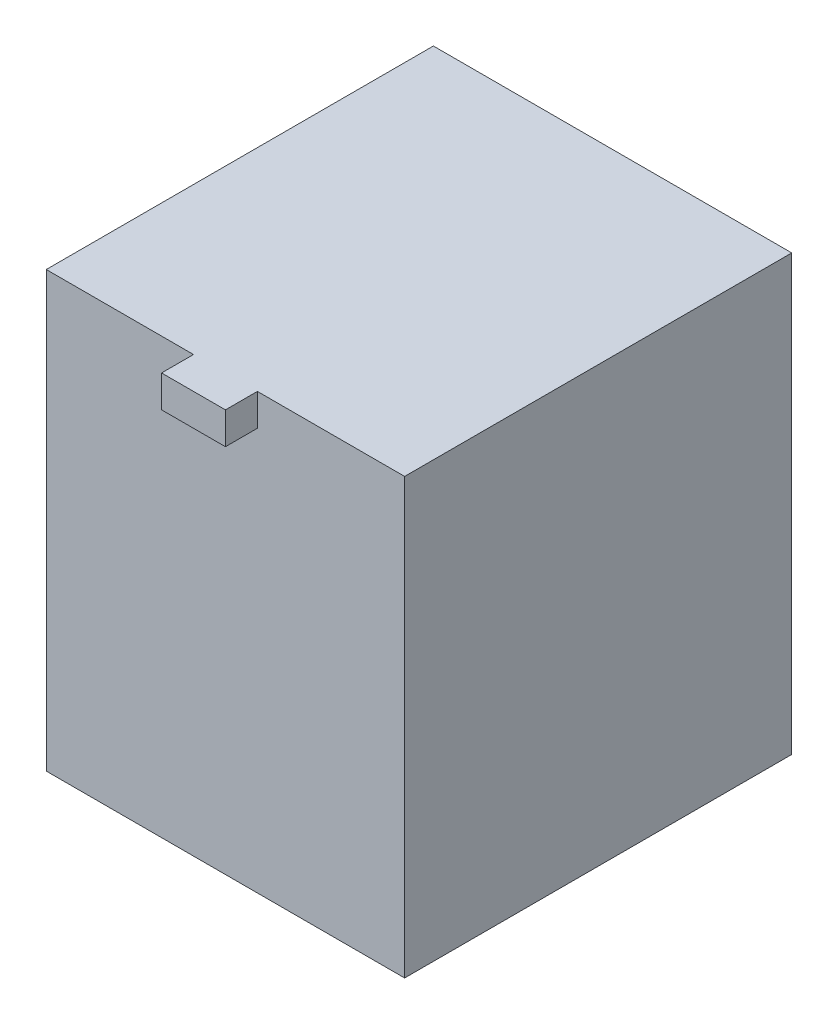
ISO-10303-21;
HEADER;
FILE_DESCRIPTION(('STEP AP214'),'2;1');
FILE_NAME('part.step','',(''),(''),'','','');
FILE_SCHEMA(('AUTOMOTIVE_DESIGN { 1 0 10303 214 1 1 1 1 }'));
ENDSEC;
DATA;
#1=APPLICATION_CONTEXT('core data for automotive mechanical design processes');
#2=APPLICATION_PROTOCOL_DEFINITION('international standard','automotive_design',2000,#1);
#3=PRODUCT_CONTEXT('',#1,'mechanical');
#4=PRODUCT('Part','Part','',(#3));
#5=PRODUCT_RELATED_PRODUCT_CATEGORY('part','',(#4));
#6=PRODUCT_DEFINITION_FORMATION('','',#4);
#7=PRODUCT_DEFINITION_CONTEXT('part definition',#1,'design');
#8=PRODUCT_DEFINITION('design','',#6,#7);
#9=PRODUCT_DEFINITION_SHAPE('','',#8);
#10=(LENGTH_UNIT() NAMED_UNIT(*) SI_UNIT(.MILLI.,.METRE.));
#11=(NAMED_UNIT(*) PLANE_ANGLE_UNIT() SI_UNIT($,.RADIAN.));
#12=(NAMED_UNIT(*) SI_UNIT($,.STERADIAN.) SOLID_ANGLE_UNIT());
#13=UNCERTAINTY_MEASURE_WITH_UNIT(LENGTH_MEASURE(1.E-05),#10,'distance_accuracy_value','');
#14=(GEOMETRIC_REPRESENTATION_CONTEXT(3) GLOBAL_UNCERTAINTY_ASSIGNED_CONTEXT((#13)) GLOBAL_UNIT_ASSIGNED_CONTEXT((#10,
#11,#12)) REPRESENTATION_CONTEXT('',''));
#15=CARTESIAN_POINT('',(0.,0.,0.));
#16=DIRECTION('',(0.,0.,1.));
#17=DIRECTION('',(1.,0.,0.));
#18=AXIS2_PLACEMENT_3D('',#15,#16,#17);
#19=CARTESIAN_POINT('',(28.05,68.,30.3));
#20=DIRECTION('',(-1.,0.,0.));
#21=DIRECTION('',(0.,0.,1.));
#22=AXIS2_PLACEMENT_3D('',#19,#20,#21);
#23=PLANE('',#22);
#24=DIRECTION('',(0.,0.,-1.));
#25=VECTOR('',#24,1.);
#26=CARTESIAN_POINT('',(28.05,0.,30.3));
#27=LINE('',#26,#25);
#28=CARTESIAN_POINT('',(28.05,0.,30.3));
#29=VERTEX_POINT('',#28);
#30=CARTESIAN_POINT('',(28.05,0.,-30.3));
#31=VERTEX_POINT('',#30);
#32=EDGE_CURVE('E138',#29,#31,#27,.T.);
#33=ORIENTED_EDGE('',*,*,#32,.T.);
#34=DIRECTION('',(0.,-1.,0.));
#35=VECTOR('',#34,1.);
#36=CARTESIAN_POINT('',(28.05,68.,-30.3));
#37=LINE('',#36,#35);
#38=CARTESIAN_POINT('',(28.05,68.,-30.3));
#39=VERTEX_POINT('',#38);
#40=EDGE_CURVE('E11',#39,#31,#37,.T.);
#41=ORIENTED_EDGE('',*,*,#40,.F.);
#42=DIRECTION('',(0.,0.,-1.));
#43=VECTOR('',#42,1.);
#44=CARTESIAN_POINT('',(28.05,68.,30.3));
#45=LINE('',#44,#43);
#46=CARTESIAN_POINT('',(28.05,68.,30.3));
#47=VERTEX_POINT('',#46);
#48=EDGE_CURVE('E149',#47,#39,#45,.T.);
#49=ORIENTED_EDGE('',*,*,#48,.F.);
#50=DIRECTION('',(0.,-1.,0.));
#51=VECTOR('',#50,1.);
#52=CARTESIAN_POINT('',(28.05,68.,30.3));
#53=LINE('',#52,#51);
#54=EDGE_CURVE('E160',#47,#29,#53,.T.);
#55=ORIENTED_EDGE('',*,*,#54,.T.);
#56=EDGE_LOOP('',(#33,#41,#49,#55));
#57=FACE_BOUND('',#56,.T.);
#58=ADVANCED_FACE('F45',(#57),#23,.F.);
#59=CARTESIAN_POINT('',(-28.05,68.,-30.3));
#60=DIRECTION('',(0.,0.,1.));
#61=DIRECTION('',(1.,0.,0.));
#62=AXIS2_PLACEMENT_3D('',#59,#60,#61);
#63=PLANE('',#62);
#64=DIRECTION('',(-1.,0.,0.));
#65=VECTOR('',#64,1.);
#66=CARTESIAN_POINT('',(-28.05,0.,-30.3));
#67=LINE('',#66,#65);
#68=CARTESIAN_POINT('',(-28.05,0.,-30.3));
#69=VERTEX_POINT('',#68);
#70=EDGE_CURVE('E143',#31,#69,#67,.T.);
#71=ORIENTED_EDGE('',*,*,#70,.T.);
#72=DIRECTION('',(0.,-1.,0.));
#73=VECTOR('',#72,1.);
#74=CARTESIAN_POINT('',(-28.05,68.,-30.3));
#75=LINE('',#74,#73);
#76=CARTESIAN_POINT('',(-28.05,68.,-30.3));
#77=VERTEX_POINT('',#76);
#78=EDGE_CURVE('E53',#77,#69,#75,.T.);
#79=ORIENTED_EDGE('',*,*,#78,.F.);
#80=DIRECTION('',(-1.,0.,0.));
#81=VECTOR('',#80,1.);
#82=CARTESIAN_POINT('',(-28.05,68.,-30.3));
#83=LINE('',#82,#81);
#84=EDGE_CURVE('E152',#39,#77,#83,.T.);
#85=ORIENTED_EDGE('',*,*,#84,.F.);
#86=ORIENTED_EDGE('',*,*,#40,.T.);
#87=EDGE_LOOP('',(#71,#79,#85,#86));
#88=FACE_BOUND('',#87,.T.);
#89=ADVANCED_FACE('F223',(#88),#63,.F.);
#90=CARTESIAN_POINT('',(-28.05,68.,30.3));
#91=DIRECTION('',(1.,0.,0.));
#92=DIRECTION('',(0.,0.,-1.));
#93=AXIS2_PLACEMENT_3D('',#90,#91,#92);
#94=PLANE('',#93);
#95=DIRECTION('',(0.,0.,1.));
#96=VECTOR('',#95,1.);
#97=CARTESIAN_POINT('',(-28.05,0.,30.3));
#98=LINE('',#97,#96);
#99=CARTESIAN_POINT('',(-28.05,0.,30.3));
#100=VERTEX_POINT('',#99);
#101=EDGE_CURVE('E164',#69,#100,#98,.T.);
#102=ORIENTED_EDGE('',*,*,#101,.T.);
#103=DIRECTION('',(0.,-1.,0.));
#104=VECTOR('',#103,1.);
#105=CARTESIAN_POINT('',(-28.05,68.,30.3));
#106=LINE('',#105,#104);
#107=CARTESIAN_POINT('',(-28.05,68.,30.3));
#108=VERTEX_POINT('',#107);
#109=EDGE_CURVE('E172',#108,#100,#106,.T.);
#110=ORIENTED_EDGE('',*,*,#109,.F.);
#111=DIRECTION('',(0.,0.,1.));
#112=VECTOR('',#111,1.);
#113=CARTESIAN_POINT('',(-28.05,68.,30.3));
#114=LINE('',#113,#112);
#115=EDGE_CURVE('E156',#77,#108,#114,.T.);
#116=ORIENTED_EDGE('',*,*,#115,.F.);
#117=ORIENTED_EDGE('',*,*,#78,.T.);
#118=EDGE_LOOP('',(#102,#110,#116,#117));
#119=FACE_BOUND('',#118,.T.);
#120=ADVANCED_FACE('F181',(#119),#94,.F.);
#121=CARTESIAN_POINT('',(-28.05,68.,30.3));
#122=DIRECTION('',(0.,0.,-1.));
#123=DIRECTION('',(-1.,0.,0.));
#124=AXIS2_PLACEMENT_3D('',#121,#122,#123);
#125=PLANE('',#124);
#126=DIRECTION('',(1.,0.,0.));
#127=VECTOR('',#126,1.);
#128=CARTESIAN_POINT('',(-28.05,68.,30.3));
#129=LINE('',#128,#127);
#130=CARTESIAN_POINT('',(5.,68.,30.3));
#131=VERTEX_POINT('',#130);
#132=EDGE_CURVE('E65',#131,#47,#129,.T.);
#133=ORIENTED_EDGE('',*,*,#132,.F.);
#134=DIRECTION('',(0.,-1.,0.));
#135=VECTOR('',#134,1.);
#136=CARTESIAN_POINT('',(5.,0.,30.3));
#137=LINE('',#136,#135);
#138=CARTESIAN_POINT('',(5.,63.,30.3));
#139=VERTEX_POINT('',#138);
#140=EDGE_CURVE('E60',#131,#139,#137,.T.);
#141=ORIENTED_EDGE('',*,*,#140,.T.);
#142=DIRECTION('',(-1.,0.,0.));
#143=VECTOR('',#142,1.);
#144=CARTESIAN_POINT('',(-3.49720252756924E-13,63.,30.3));
#145=LINE('',#144,#143);
#146=CARTESIAN_POINT('',(-5.00000000000001,62.9999999999999,30.3));
#147=VERTEX_POINT('',#146);
#148=EDGE_CURVE('E200',#139,#147,#145,.T.);
#149=ORIENTED_EDGE('',*,*,#148,.T.);
#150=DIRECTION('',(0.,-1.,0.));
#151=VECTOR('',#150,1.);
#152=CARTESIAN_POINT('',(-5.00000000000001,0.,30.3));
#153=LINE('',#152,#151);
#154=CARTESIAN_POINT('',(-5.,68.,30.3));
#155=VERTEX_POINT('',#154);
#156=EDGE_CURVE('E203',#155,#147,#153,.T.);
#157=ORIENTED_EDGE('',*,*,#156,.F.);
#158=EDGE_CURVE('E136',#108,#155,#129,.T.);
#159=ORIENTED_EDGE('',*,*,#158,.F.);
#160=ORIENTED_EDGE('',*,*,#109,.T.);
#161=DIRECTION('',(1.,0.,0.));
#162=VECTOR('',#161,1.);
#163=CARTESIAN_POINT('',(-28.05,0.,30.3));
#164=LINE('',#163,#162);
#165=EDGE_CURVE('E153',#100,#29,#164,.T.);
#166=ORIENTED_EDGE('',*,*,#165,.T.);
#167=ORIENTED_EDGE('',*,*,#54,.F.);
#168=EDGE_LOOP('',(#133,#141,#149,#157,#159,#160,#166,#167));
#169=FACE_BOUND('',#168,.T.);
#170=ADVANCED_FACE('F188',(#169),#125,.F.);
#171=CARTESIAN_POINT('',(0.,68.,0.));
#172=DIRECTION('',(0.,-1.,0.));
#173=DIRECTION('',(0.,0.,-1.));
#174=AXIS2_PLACEMENT_3D('',#171,#172,#173);
#175=PLANE('',#174);
#176=ORIENTED_EDGE('',*,*,#48,.T.);
#177=ORIENTED_EDGE('',*,*,#84,.T.);
#178=ORIENTED_EDGE('',*,*,#115,.T.);
#179=ORIENTED_EDGE('',*,*,#158,.T.);
#180=DIRECTION('',(0.,0.,-1.));
#181=VECTOR('',#180,1.);
#182=CARTESIAN_POINT('',(-5.00000000000001,68.,35.3));
#183=LINE('',#182,#181);
#184=CARTESIAN_POINT('',(-5.00000000000001,68.,35.3));
#185=VERTEX_POINT('',#184);
#186=EDGE_CURVE('E114',#185,#155,#183,.T.);
#187=ORIENTED_EDGE('',*,*,#186,.F.);
#188=DIRECTION('',(-1.,0.,0.));
#189=VECTOR('',#188,1.);
#190=CARTESIAN_POINT('',(0.,68.,35.3));
#191=LINE('',#190,#189);
#192=CARTESIAN_POINT('',(5.,68.,35.3));
#193=VERTEX_POINT('',#192);
#194=EDGE_CURVE('E122',#193,#185,#191,.T.);
#195=ORIENTED_EDGE('',*,*,#194,.F.);
#196=DIRECTION('',(0.,0.,-1.));
#197=VECTOR('',#196,1.);
#198=CARTESIAN_POINT('',(5.,68.,35.3));
#199=LINE('',#198,#197);
#200=EDGE_CURVE('E192',#193,#131,#199,.T.);
#201=ORIENTED_EDGE('',*,*,#200,.T.);
#202=ORIENTED_EDGE('',*,*,#132,.T.);
#203=EDGE_LOOP('',(#176,#177,#178,#179,#187,#195,#201,#202));
#204=FACE_BOUND('',#203,.T.);
#205=ADVANCED_FACE('F134',(#204),#175,.F.);
#206=CARTESIAN_POINT('',(0.,0.,0.));
#207=DIRECTION('',(0.,-1.,0.));
#208=DIRECTION('',(0.,0.,-1.));
#209=AXIS2_PLACEMENT_3D('',#206,#207,#208);
#210=PLANE('',#209);
#211=ORIENTED_EDGE('',*,*,#32,.F.);
#212=ORIENTED_EDGE('',*,*,#165,.F.);
#213=ORIENTED_EDGE('',*,*,#101,.F.);
#214=ORIENTED_EDGE('',*,*,#70,.F.);
#215=EDGE_LOOP('',(#211,#212,#213,#214));
#216=FACE_BOUND('',#215,.T.);
#217=ADVANCED_FACE('F187',(#216),#210,.T.);
#218=CARTESIAN_POINT('',(-5.00000000000001,0.,35.3));
#219=DIRECTION('',(1.,0.,0.));
#220=DIRECTION('',(0.,0.,-1.));
#221=AXIS2_PLACEMENT_3D('',#218,#219,#220);
#222=PLANE('',#221);
#223=ORIENTED_EDGE('',*,*,#156,.T.);
#224=DIRECTION('',(0.,0.,-1.));
#225=VECTOR('',#224,1.);
#226=CARTESIAN_POINT('',(-5.00000000000001,62.9999999999999,35.3));
#227=LINE('',#226,#225);
#228=CARTESIAN_POINT('',(-5.00000000000001,62.9999999999999,35.3));
#229=VERTEX_POINT('',#228);
#230=EDGE_CURVE('E116',#229,#147,#227,.T.);
#231=ORIENTED_EDGE('',*,*,#230,.F.);
#232=DIRECTION('',(0.,-1.,0.));
#233=VECTOR('',#232,1.);
#234=CARTESIAN_POINT('',(-5.00000000000001,0.,35.3));
#235=LINE('',#234,#233);
#236=EDGE_CURVE('E109',#185,#229,#235,.T.);
#237=ORIENTED_EDGE('',*,*,#236,.F.);
#238=ORIENTED_EDGE('',*,*,#186,.T.);
#239=EDGE_LOOP('',(#223,#231,#237,#238));
#240=FACE_BOUND('',#239,.T.);
#241=ADVANCED_FACE('F112',(#240),#222,.F.);
#242=CARTESIAN_POINT('',(-3.49720252756924E-13,63.,35.3));
#243=DIRECTION('',(0.,-1.,0.));
#244=DIRECTION('',(1.,0.,0.));
#245=AXIS2_PLACEMENT_3D('',#242,#243,#244);
#246=PLANE('',#245);
#247=ORIENTED_EDGE('',*,*,#148,.F.);
#248=DIRECTION('',(0.,0.,-1.));
#249=VECTOR('',#248,1.);
#250=CARTESIAN_POINT('',(5.,63.,35.3));
#251=LINE('',#250,#249);
#252=CARTESIAN_POINT('',(5.,63.,35.3));
#253=VERTEX_POINT('',#252);
#254=EDGE_CURVE('E145',#253,#139,#251,.T.);
#255=ORIENTED_EDGE('',*,*,#254,.F.);
#256=DIRECTION('',(-1.,0.,0.));
#257=VECTOR('',#256,1.);
#258=CARTESIAN_POINT('',(-3.49720252756924E-13,63.,35.3));
#259=LINE('',#258,#257);
#260=EDGE_CURVE('E121',#253,#229,#259,.T.);
#261=ORIENTED_EDGE('',*,*,#260,.T.);
#262=ORIENTED_EDGE('',*,*,#230,.T.);
#263=EDGE_LOOP('',(#247,#255,#261,#262));
#264=FACE_BOUND('',#263,.T.);
#265=ADVANCED_FACE('F213',(#264),#246,.T.);
#266=CARTESIAN_POINT('',(5.,0.,35.3));
#267=DIRECTION('',(1.,0.,0.));
#268=DIRECTION('',(0.,0.,-1.));
#269=AXIS2_PLACEMENT_3D('',#266,#267,#268);
#270=PLANE('',#269);
#271=ORIENTED_EDGE('',*,*,#140,.F.);
#272=ORIENTED_EDGE('',*,*,#200,.F.);
#273=DIRECTION('',(0.,-1.,0.));
#274=VECTOR('',#273,1.);
#275=CARTESIAN_POINT('',(5.,0.,35.3));
#276=LINE('',#275,#274);
#277=EDGE_CURVE('E128',#193,#253,#276,.T.);
#278=ORIENTED_EDGE('',*,*,#277,.T.);
#279=ORIENTED_EDGE('',*,*,#254,.T.);
#280=EDGE_LOOP('',(#271,#272,#278,#279));
#281=FACE_BOUND('',#280,.T.);
#282=ADVANCED_FACE('F197',(#281),#270,.T.);
#283=CARTESIAN_POINT('',(0.,0.,35.3));
#284=DIRECTION('',(0.,0.,1.));
#285=DIRECTION('',(1.,0.,0.));
#286=AXIS2_PLACEMENT_3D('',#283,#284,#285);
#287=PLANE('',#286);
#288=ORIENTED_EDGE('',*,*,#194,.T.);
#289=ORIENTED_EDGE('',*,*,#236,.T.);
#290=ORIENTED_EDGE('',*,*,#260,.F.);
#291=ORIENTED_EDGE('',*,*,#277,.F.);
#292=EDGE_LOOP('',(#288,#289,#290,#291));
#293=FACE_BOUND('',#292,.T.);
#294=ADVANCED_FACE('F126',(#293),#287,.T.);
#295=CLOSED_SHELL('',(#58,#89,#120,#170,#205,#217,#241,#265,#282,#294));
#296=MANIFOLD_SOLID_BREP('B2',#295);
#297=ADVANCED_BREP_SHAPE_REPRESENTATION('',(#18,#296),#14);
#298=SHAPE_DEFINITION_REPRESENTATION(#9,#297);
ENDSEC;
END-ISO-10303-21;
